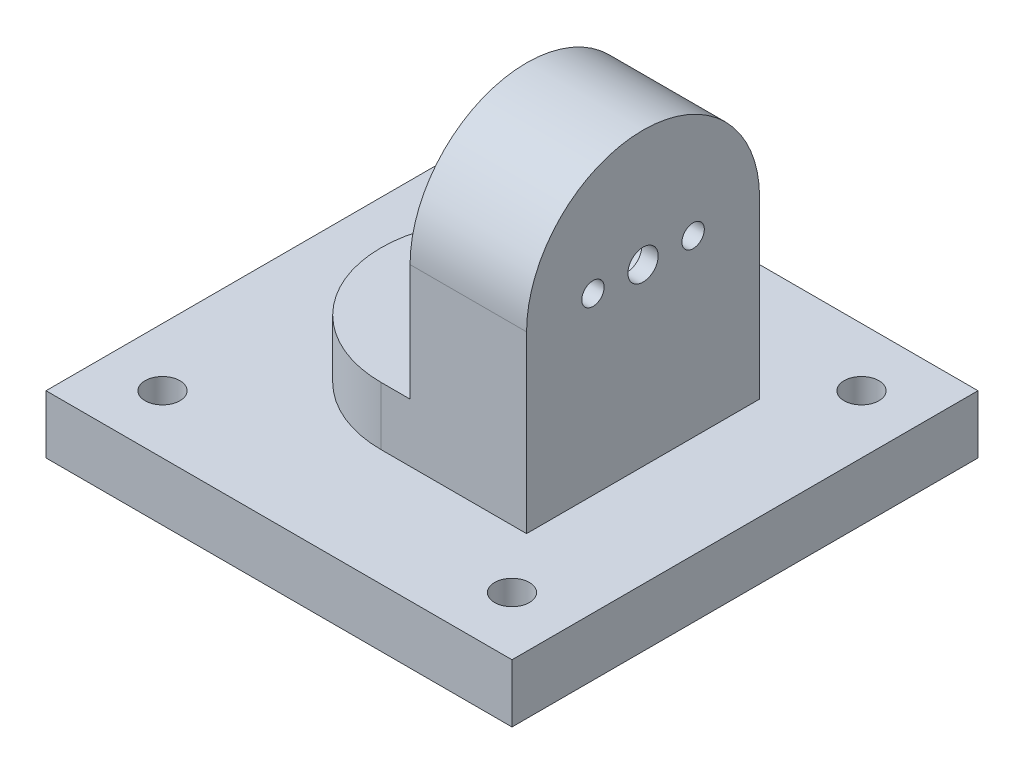
ISO-10303-21;
HEADER;
FILE_DESCRIPTION(('STEP AP214'),'2;1');
FILE_NAME('part.step','',(''),(''),'','','');
FILE_SCHEMA(('AUTOMOTIVE_DESIGN { 1 0 10303 214 1 1 1 1 }'));
ENDSEC;
DATA;
#1=APPLICATION_CONTEXT('core data for automotive mechanical design processes');
#2=APPLICATION_PROTOCOL_DEFINITION('international standard','automotive_design',2000,#1);
#3=PRODUCT_CONTEXT('',#1,'mechanical');
#4=PRODUCT('Part','Part','',(#3));
#5=PRODUCT_RELATED_PRODUCT_CATEGORY('part','',(#4));
#6=PRODUCT_DEFINITION_FORMATION('','',#4);
#7=PRODUCT_DEFINITION_CONTEXT('part definition',#1,'design');
#8=PRODUCT_DEFINITION('design','',#6,#7);
#9=PRODUCT_DEFINITION_SHAPE('','',#8);
#10=(LENGTH_UNIT() NAMED_UNIT(*) SI_UNIT(.MILLI.,.METRE.));
#11=(NAMED_UNIT(*) PLANE_ANGLE_UNIT() SI_UNIT($,.RADIAN.));
#12=(NAMED_UNIT(*) SI_UNIT($,.STERADIAN.) SOLID_ANGLE_UNIT());
#13=UNCERTAINTY_MEASURE_WITH_UNIT(LENGTH_MEASURE(1.E-05),#10,'distance_accuracy_value','');
#14=(GEOMETRIC_REPRESENTATION_CONTEXT(3) GLOBAL_UNCERTAINTY_ASSIGNED_CONTEXT((#13)) GLOBAL_UNIT_ASSIGNED_CONTEXT((#10,
#11,#12)) REPRESENTATION_CONTEXT('',''));
#15=CARTESIAN_POINT('',(0.,0.,0.));
#16=DIRECTION('',(0.,0.,1.));
#17=DIRECTION('',(1.,0.,0.));
#18=AXIS2_PLACEMENT_3D('',#15,#16,#17);
#19=CARTESIAN_POINT('',(39.2236659147798,19.05,0.));
#20=DIRECTION('',(-1.,0.,0.));
#21=DIRECTION('',(0.,0.,1.));
#22=AXIS2_PLACEMENT_3D('',#19,#20,#21);
#23=CYLINDRICAL_SURFACE('',#22,8.255);
#24=CARTESIAN_POINT('',(11.5377722,19.05,0.));
#25=DIRECTION('',(-1.,0.,0.));
#26=DIRECTION('',(0.,0.,1.));
#27=AXIS2_PLACEMENT_3D('',#24,#25,#26);
#28=CIRCLE('',#27,8.255);
#29=CARTESIAN_POINT('',(11.5377722,19.05,8.255));
#30=VERTEX_POINT('',#29);
#31=EDGE_CURVE('E167',#30,#30,#28,.F.);
#32=ORIENTED_EDGE('',*,*,#31,.T.);
#33=EDGE_LOOP('',(#32));
#34=FACE_BOUND('',#33,.T.);
#35=CARTESIAN_POINT('',(8.3627722,19.05,0.));
#36=DIRECTION('',(-1.,0.,0.));
#37=DIRECTION('',(0.,0.,1.));
#38=AXIS2_PLACEMENT_3D('',#35,#36,#37);
#39=CIRCLE('',#38,8.255);
#40=CARTESIAN_POINT('',(8.3627722,19.05,8.255));
#41=VERTEX_POINT('',#40);
#42=EDGE_CURVE('E43',#41,#41,#39,.F.);
#43=ORIENTED_EDGE('',*,*,#42,.F.);
#44=EDGE_LOOP('',(#43));
#45=FACE_BOUND('',#44,.T.);
#46=ADVANCED_FACE('F39',(#34,#45),#23,.F.);
#47=CARTESIAN_POINT('',(26.651307345283,19.05,0.));
#48=DIRECTION('',(-1.,0.,0.));
#49=DIRECTION('',(0.,0.,1.));
#50=AXIS2_PLACEMENT_3D('',#47,#48,#49);
#51=CYLINDRICAL_SURFACE('',#50,3.81);
#52=CARTESIAN_POINT('',(14.0777722,19.05,0.));
#53=DIRECTION('',(-1.,0.,0.));
#54=DIRECTION('',(0.,0.,1.));
#55=AXIS2_PLACEMENT_3D('',#52,#53,#54);
#56=CIRCLE('',#55,3.81);
#57=CARTESIAN_POINT('',(14.0777722,19.05,3.81));
#58=VERTEX_POINT('',#57);
#59=EDGE_CURVE('E171',#58,#58,#56,.F.);
#60=CARTESIAN_POINT('',(11.5377722,19.05,0.));
#61=DIRECTION('',(-1.,0.,0.));
#62=DIRECTION('',(0.,0.,1.));
#63=AXIS2_PLACEMENT_3D('',#60,#61,#62);
#64=CIRCLE('',#63,3.81);
#65=CARTESIAN_POINT('',(11.5377722,19.05,3.81));
#66=VERTEX_POINT('',#65);
#67=EDGE_CURVE('E170',#66,#66,#64,.F.);
#68=CARTESIAN_POINT('',(14.0777722,19.05,3.81));
#69=CARTESIAN_POINT('',(14.0513138666667,19.05,3.81));
#70=CARTESIAN_POINT('',(14.0248555333333,19.05,3.81));
#71=CARTESIAN_POINT('',(13.9719388666667,19.05,3.81));
#72=CARTESIAN_POINT('',(13.9454805333333,19.05,3.81));
#73=CARTESIAN_POINT('',(13.8925638666667,19.05,3.81));
#74=CARTESIAN_POINT('',(13.8661055333333,19.05,3.81));
#75=CARTESIAN_POINT('',(13.8131888666667,19.05,3.81));
#76=CARTESIAN_POINT('',(13.7867305333333,19.05,3.81));
#77=CARTESIAN_POINT('',(13.7338138666667,19.05,3.81));
#78=CARTESIAN_POINT('',(13.7073555333333,19.05,3.81));
#79=CARTESIAN_POINT('',(13.6544388666667,19.05,3.81));
#80=CARTESIAN_POINT('',(13.6279805333333,19.05,3.81));
#81=CARTESIAN_POINT('',(13.5750638666667,19.05,3.81));
#82=CARTESIAN_POINT('',(13.5486055333333,19.05,3.81));
#83=CARTESIAN_POINT('',(13.4956888666667,19.05,3.81));
#84=CARTESIAN_POINT('',(13.4692305333333,19.05,3.81));
#85=CARTESIAN_POINT('',(13.4163138666667,19.05,3.81));
#86=CARTESIAN_POINT('',(13.3898555333333,19.05,3.81));
#87=CARTESIAN_POINT('',(13.3369388666667,19.05,3.81));
#88=CARTESIAN_POINT('',(13.3104805333333,19.05,3.81));
#89=CARTESIAN_POINT('',(13.2575638666667,19.05,3.81));
#90=CARTESIAN_POINT('',(13.2311055333333,19.05,3.81));
#91=CARTESIAN_POINT('',(13.1781888666667,19.05,3.81));
#92=CARTESIAN_POINT('',(13.1517305333333,19.05,3.81));
#93=CARTESIAN_POINT('',(13.0988138666667,19.05,3.81));
#94=CARTESIAN_POINT('',(13.0723555333333,19.05,3.81));
#95=CARTESIAN_POINT('',(13.0194388666667,19.05,3.81));
#96=CARTESIAN_POINT('',(12.9929805333333,19.05,3.81));
#97=CARTESIAN_POINT('',(12.9400638666667,19.05,3.81));
#98=CARTESIAN_POINT('',(12.9136055333333,19.05,3.81));
#99=CARTESIAN_POINT('',(12.8606888666667,19.05,3.81));
#100=CARTESIAN_POINT('',(12.8342305333333,19.05,3.81));
#101=CARTESIAN_POINT('',(12.7813138666667,19.05,3.81));
#102=CARTESIAN_POINT('',(12.7548555333333,19.05,3.81));
#103=CARTESIAN_POINT('',(12.7019388666667,19.05,3.81));
#104=CARTESIAN_POINT('',(12.6754805333333,19.05,3.81));
#105=CARTESIAN_POINT('',(12.6225638666667,19.05,3.81));
#106=CARTESIAN_POINT('',(12.5961055333333,19.05,3.81));
#107=CARTESIAN_POINT('',(12.5431888666667,19.05,3.81));
#108=CARTESIAN_POINT('',(12.5167305333333,19.05,3.81));
#109=CARTESIAN_POINT('',(12.4638138666667,19.05,3.81));
#110=CARTESIAN_POINT('',(12.4373555333333,19.05,3.81));
#111=CARTESIAN_POINT('',(12.3844388666667,19.05,3.81));
#112=CARTESIAN_POINT('',(12.3579805333333,19.05,3.81));
#113=CARTESIAN_POINT('',(12.3050638666667,19.05,3.81));
#114=CARTESIAN_POINT('',(12.2786055333333,19.05,3.81));
#115=CARTESIAN_POINT('',(12.2256888666667,19.05,3.81));
#116=CARTESIAN_POINT('',(12.1992305333333,19.05,3.81));
#117=CARTESIAN_POINT('',(12.1463138666667,19.05,3.81));
#118=CARTESIAN_POINT('',(12.1198555333333,19.05,3.81));
#119=CARTESIAN_POINT('',(12.0669388666667,19.05,3.81));
#120=CARTESIAN_POINT('',(12.0404805333333,19.05,3.81));
#121=CARTESIAN_POINT('',(11.9875638666667,19.05,3.81));
#122=CARTESIAN_POINT('',(11.9611055333333,19.05,3.81));
#123=CARTESIAN_POINT('',(11.9081888666667,19.05,3.81));
#124=CARTESIAN_POINT('',(11.8817305333333,19.05,3.81));
#125=CARTESIAN_POINT('',(11.8288138666667,19.05,3.81));
#126=CARTESIAN_POINT('',(11.8023555333333,19.05,3.81));
#127=CARTESIAN_POINT('',(11.7494388666667,19.05,3.81));
#128=CARTESIAN_POINT('',(11.7229805333333,19.05,3.81));
#129=CARTESIAN_POINT('',(11.6700638666667,19.05,3.81));
#130=CARTESIAN_POINT('',(11.6436055333333,19.05,3.81));
#131=CARTESIAN_POINT('',(11.5906888666667,19.05,3.81));
#132=CARTESIAN_POINT('',(11.5642305333333,19.05,3.81));
#133=CARTESIAN_POINT('',(11.5377722,19.05,3.81));
#134=B_SPLINE_CURVE_WITH_KNOTS('',3,(#68,#69,#70,#71,#72,#73,#74,#75,#76,#77,#78,#79,#80,#81,
#82,#83,#84,#85,#86,#87,#88,#89,#90,#91,#92,#93,#94,#95,#96,#97,#98,#99,#100,#101,#102,#103,
#104,#105,#106,#107,#108,#109,#110,#111,#112,#113,#114,#115,#116,#117,#118,#119,#120,#121,#122,
#123,#124,#125,#126,#127,#128,#129,#130,#131,#132,#133),.UNSPECIFIED.,.F.,.F.,(4,2,2,2,2,2,2,2,
2,2,2,2,2,2,2,2,2,2,2,2,2,2,2,2,2,2,2,2,2,2,2,2,4),(0.,0.0793749999999996,0.158749999999999,
0.238125,0.3175,0.396875,0.476249999999999,0.555624999999999,0.635,0.714375,0.793749999999999,
0.873124999999999,0.952499999999998,1.031875,1.11125,1.190625,1.27,1.349375,1.42875,1.508125,
1.5875,1.666875,1.74625,1.825625,1.905,1.984375,2.06375,2.143125,2.2225,2.301875,2.38125,
2.460625,2.54),.UNSPECIFIED.);
#135=EDGE_CURVE('BSEAM208',#58,#66,#134,.T.);
#136=ORIENTED_EDGE('',*,*,#59,.T.);
#137=ORIENTED_EDGE('',*,*,#67,.F.);
#138=ORIENTED_EDGE('',*,*,#135,.T.);
#139=ORIENTED_EDGE('',*,*,#135,.F.);
#140=EDGE_LOOP('',(#136,#138,#137,#139));
#141=FACE_BOUND('',#140,.T.);
#142=ADVANCED_FACE('F208',(#141),#51,.F.);
#143=CARTESIAN_POINT('',(20.544733182956,19.05,0.));
#144=DIRECTION('',(-1.,0.,0.));
#145=DIRECTION('',(0.,0.,1.));
#146=AXIS2_PLACEMENT_3D('',#143,#144,#145);
#147=CYLINDRICAL_SURFACE('',#146,1.651);
#148=CARTESIAN_POINT('',(15.875,19.05,0.));
#149=DIRECTION('',(-1.,0.,0.));
#150=DIRECTION('',(0.,0.,1.));
#151=AXIS2_PLACEMENT_3D('',#148,#149,#150);
#152=CIRCLE('',#151,1.651);
#153=CARTESIAN_POINT('',(15.875,19.05,1.651));
#154=VERTEX_POINT('',#153);
#155=EDGE_CURVE('E175',#154,#154,#152,.F.);
#156=ORIENTED_EDGE('',*,*,#155,.T.);
#157=EDGE_LOOP('',(#156));
#158=FACE_BOUND('',#157,.T.);
#159=CARTESIAN_POINT('',(14.0777722,19.05,0.));
#160=DIRECTION('',(-1.,0.,0.));
#161=DIRECTION('',(0.,0.,1.));
#162=AXIS2_PLACEMENT_3D('',#159,#160,#161);
#163=CIRCLE('',#162,1.651);
#164=CARTESIAN_POINT('',(14.0777722,19.05,1.651));
#165=VERTEX_POINT('',#164);
#166=EDGE_CURVE('E174',#165,#165,#163,.F.);
#167=ORIENTED_EDGE('',*,*,#166,.F.);
#168=EDGE_LOOP('',(#167));
#169=FACE_BOUND('',#168,.T.);
#170=ADVANCED_FACE('F210',(#158,#169),#147,.F.);
#171=CARTESIAN_POINT('',(0.,6.35,0.));
#172=DIRECTION('',(0.,-1.,0.));
#173=DIRECTION('',(0.,0.,-1.));
#174=AXIS2_PLACEMENT_3D('',#171,#172,#173);
#175=CYLINDRICAL_SURFACE('',#174,12.7);
#176=CARTESIAN_POINT('',(0.,6.35,0.));
#177=DIRECTION('',(0.,1.,0.));
#178=DIRECTION('',(0.,0.,1.));
#179=AXIS2_PLACEMENT_3D('',#176,#177,#178);
#180=CIRCLE('',#179,12.7);
#181=CARTESIAN_POINT('',(0.,6.35,-12.7));
#182=VERTEX_POINT('',#181);
#183=CARTESIAN_POINT('',(0.,6.35,12.7));
#184=VERTEX_POINT('',#183);
#185=EDGE_CURVE('E12',#182,#184,#180,.T.);
#186=ORIENTED_EDGE('',*,*,#185,.F.);
#187=DIRECTION('',(0.,1.,0.));
#188=VECTOR('',#187,1.);
#189=CARTESIAN_POINT('',(0.,-29.9528900942797,-12.7));
#190=LINE('',#189,#188);
#191=CARTESIAN_POINT('',(0.,0.,-12.7));
#192=VERTEX_POINT('',#191);
#193=EDGE_CURVE('E490',#192,#182,#190,.T.);
#194=ORIENTED_EDGE('',*,*,#193,.F.);
#195=CARTESIAN_POINT('',(0.,0.,0.));
#196=DIRECTION('',(0.,1.,0.));
#197=DIRECTION('',(0.,0.,1.));
#198=AXIS2_PLACEMENT_3D('',#195,#196,#197);
#199=CIRCLE('',#198,12.7);
#200=CARTESIAN_POINT('',(0.,0.,12.7));
#201=VERTEX_POINT('',#200);
#202=EDGE_CURVE('E48',#192,#201,#199,.T.);
#203=ORIENTED_EDGE('',*,*,#202,.T.);
#204=DIRECTION('',(0.,1.,0.));
#205=VECTOR('',#204,1.);
#206=CARTESIAN_POINT('',(0.,-29.9528900942797,12.7));
#207=LINE('',#206,#205);
#208=EDGE_CURVE('E494',#201,#184,#207,.T.);
#209=ORIENTED_EDGE('',*,*,#208,.T.);
#210=EDGE_LOOP('',(#186,#194,#203,#209));
#211=FACE_BOUND('',#210,.T.);
#212=ADVANCED_FACE('F41',(#211),#175,.T.);
#213=CARTESIAN_POINT('',(0.,6.35,0.));
#214=DIRECTION('',(0.,1.,0.));
#215=DIRECTION('',(0.,0.,1.));
#216=AXIS2_PLACEMENT_3D('',#213,#214,#215);
#217=PLANE('',#216);
#218=DIRECTION('',(0.,0.,1.));
#219=VECTOR('',#218,1.);
#220=CARTESIAN_POINT('',(3.175,6.35,0.));
#221=LINE('',#220,#219);
#222=CARTESIAN_POINT('',(3.175,6.35,-12.7));
#223=VERTEX_POINT('',#222);
#224=CARTESIAN_POINT('',(3.175,6.35,12.7));
#225=VERTEX_POINT('',#224);
#226=EDGE_CURVE('E56',#223,#225,#221,.T.);
#227=ORIENTED_EDGE('',*,*,#226,.F.);
#228=DIRECTION('',(1.,0.,0.));
#229=VECTOR('',#228,1.);
#230=CARTESIAN_POINT('',(0.,6.35,-12.7));
#231=LINE('',#230,#229);
#232=EDGE_CURVE('E190',#182,#223,#231,.T.);
#233=ORIENTED_EDGE('',*,*,#232,.F.);
#234=ORIENTED_EDGE('',*,*,#185,.T.);
#235=DIRECTION('',(-1.,0.,0.));
#236=VECTOR('',#235,1.);
#237=CARTESIAN_POINT('',(0.,6.35,12.7));
#238=LINE('',#237,#236);
#239=EDGE_CURVE('E499',#225,#184,#238,.T.);
#240=ORIENTED_EDGE('',*,*,#239,.F.);
#241=EDGE_LOOP('',(#227,#233,#234,#240));
#242=FACE_BOUND('',#241,.T.);
#243=ADVANCED_FACE('F240',(#242),#217,.T.);
#244=CARTESIAN_POINT('',(15.875,-29.9528900942797,0.));
#245=DIRECTION('',(-1.,0.,0.));
#246=DIRECTION('',(0.,0.,1.));
#247=AXIS2_PLACEMENT_3D('',#244,#245,#246);
#248=PLANE('',#247);
#249=CARTESIAN_POINT('',(15.875,19.05,-5.4599967));
#250=DIRECTION('',(-1.,0.,0.));
#251=DIRECTION('',(0.,0.,1.));
#252=AXIS2_PLACEMENT_3D('',#249,#250,#251);
#253=CIRCLE('',#252,1.2192);
#254=CARTESIAN_POINT('',(15.875,19.05,-4.2407967));
#255=VERTEX_POINT('',#254);
#256=EDGE_CURVE('E147',#255,#255,#253,.F.);
#257=ORIENTED_EDGE('',*,*,#256,.F.);
#258=EDGE_LOOP('',(#257));
#259=FACE_BOUND('',#258,.T.);
#260=CARTESIAN_POINT('',(15.875,19.05,5.4599967));
#261=DIRECTION('',(-1.,0.,0.));
#262=DIRECTION('',(0.,0.,1.));
#263=AXIS2_PLACEMENT_3D('',#260,#261,#262);
#264=CIRCLE('',#263,1.2192);
#265=CARTESIAN_POINT('',(15.875,19.05,6.6791967));
#266=VERTEX_POINT('',#265);
#267=EDGE_CURVE('E158',#266,#266,#264,.F.);
#268=ORIENTED_EDGE('',*,*,#267,.F.);
#269=EDGE_LOOP('',(#268));
#270=FACE_BOUND('',#269,.T.);
#271=ORIENTED_EDGE('',*,*,#155,.F.);
#272=EDGE_LOOP('',(#271));
#273=FACE_BOUND('',#272,.T.);
#274=DIRECTION('',(0.,1.,0.));
#275=VECTOR('',#274,1.);
#276=CARTESIAN_POINT('',(15.875,-29.9528900942797,12.7));
#277=LINE('',#276,#275);
#278=CARTESIAN_POINT('',(15.875,0.,12.7));
#279=VERTEX_POINT('',#278);
#280=CARTESIAN_POINT('',(15.875,19.05,12.7));
#281=VERTEX_POINT('',#280);
#282=EDGE_CURVE('E491',#279,#281,#277,.T.);
#283=ORIENTED_EDGE('',*,*,#282,.F.);
#284=DIRECTION('',(0.,0.,-1.));
#285=VECTOR('',#284,1.);
#286=CARTESIAN_POINT('',(15.875,0.,0.));
#287=LINE('',#286,#285);
#288=CARTESIAN_POINT('',(15.875,0.,-12.7));
#289=VERTEX_POINT('',#288);
#290=EDGE_CURVE('E479',#279,#289,#287,.T.);
#291=ORIENTED_EDGE('',*,*,#290,.T.);
#292=DIRECTION('',(0.,1.,0.));
#293=VECTOR('',#292,1.);
#294=CARTESIAN_POINT('',(15.875,-29.9528900942797,-12.7));
#295=LINE('',#294,#293);
#296=CARTESIAN_POINT('',(15.875,19.05,-12.7));
#297=VERTEX_POINT('',#296);
#298=EDGE_CURVE('E485',#289,#297,#295,.T.);
#299=ORIENTED_EDGE('',*,*,#298,.T.);
#300=CARTESIAN_POINT('',(15.875,19.05,0.));
#301=DIRECTION('',(1.,0.,0.));
#302=DIRECTION('',(0.,0.,-1.));
#303=AXIS2_PLACEMENT_3D('',#300,#301,#302);
#304=CIRCLE('',#303,12.7);
#305=EDGE_CURVE('E178',#297,#281,#304,.T.);
#306=ORIENTED_EDGE('',*,*,#305,.T.);
#307=EDGE_LOOP('',(#283,#291,#299,#306));
#308=FACE_BOUND('',#307,.T.);
#309=ADVANCED_FACE('F236',(#259,#270,#273,#308),#248,.F.);
#310=CARTESIAN_POINT('',(0.,-29.9528900942797,-12.7));
#311=DIRECTION('',(0.,0.,1.));
#312=DIRECTION('',(1.,0.,0.));
#313=AXIS2_PLACEMENT_3D('',#310,#311,#312);
#314=PLANE('',#313);
#315=ORIENTED_EDGE('',*,*,#298,.F.);
#316=DIRECTION('',(-1.,0.,0.));
#317=VECTOR('',#316,1.);
#318=CARTESIAN_POINT('',(0.,0.,-12.7));
#319=LINE('',#318,#317);
#320=EDGE_CURVE('E476',#289,#192,#319,.T.);
#321=ORIENTED_EDGE('',*,*,#320,.T.);
#322=ORIENTED_EDGE('',*,*,#193,.T.);
#323=ORIENTED_EDGE('',*,*,#232,.T.);
#324=DIRECTION('',(0.,1.,0.));
#325=VECTOR('',#324,1.);
#326=CARTESIAN_POINT('',(3.175,0.,-12.7));
#327=LINE('',#326,#325);
#328=CARTESIAN_POINT('',(3.175,19.05,-12.7));
#329=VERTEX_POINT('',#328);
#330=EDGE_CURVE('E189',#223,#329,#327,.T.);
#331=ORIENTED_EDGE('',*,*,#330,.T.);
#332=DIRECTION('',(1.,0.,0.));
#333=VECTOR('',#332,1.);
#334=CARTESIAN_POINT('',(3.175,19.05,-12.7));
#335=LINE('',#334,#333);
#336=EDGE_CURVE('E486',#329,#297,#335,.T.);
#337=ORIENTED_EDGE('',*,*,#336,.T.);
#338=EDGE_LOOP('',(#315,#321,#322,#323,#331,#337));
#339=FACE_BOUND('',#338,.T.);
#340=ADVANCED_FACE('F233',(#339),#314,.F.);
#341=CARTESIAN_POINT('',(0.,-29.9528900942797,12.7));
#342=DIRECTION('',(0.,0.,-1.));
#343=DIRECTION('',(-1.,0.,0.));
#344=AXIS2_PLACEMENT_3D('',#341,#342,#343);
#345=PLANE('',#344);
#346=ORIENTED_EDGE('',*,*,#208,.F.);
#347=DIRECTION('',(1.,0.,0.));
#348=VECTOR('',#347,1.);
#349=CARTESIAN_POINT('',(0.,0.,12.7));
#350=LINE('',#349,#348);
#351=EDGE_CURVE('E482',#201,#279,#350,.T.);
#352=ORIENTED_EDGE('',*,*,#351,.T.);
#353=ORIENTED_EDGE('',*,*,#282,.T.);
#354=DIRECTION('',(1.,0.,0.));
#355=VECTOR('',#354,1.);
#356=CARTESIAN_POINT('',(3.175,19.05,12.7));
#357=LINE('',#356,#355);
#358=CARTESIAN_POINT('',(3.175,19.05,12.7));
#359=VERTEX_POINT('',#358);
#360=EDGE_CURVE('E199',#359,#281,#357,.T.);
#361=ORIENTED_EDGE('',*,*,#360,.F.);
#362=DIRECTION('',(0.,-1.,0.));
#363=VECTOR('',#362,1.);
#364=CARTESIAN_POINT('',(3.175,0.,12.7));
#365=LINE('',#364,#363);
#366=EDGE_CURVE('E182',#359,#225,#365,.T.);
#367=ORIENTED_EDGE('',*,*,#366,.T.);
#368=ORIENTED_EDGE('',*,*,#239,.T.);
#369=EDGE_LOOP('',(#346,#352,#353,#361,#367,#368));
#370=FACE_BOUND('',#369,.T.);
#371=ADVANCED_FACE('F231',(#370),#345,.F.);
#372=CARTESIAN_POINT('',(3.175,19.05,0.));
#373=DIRECTION('',(1.,0.,0.));
#374=DIRECTION('',(0.,0.,-1.));
#375=AXIS2_PLACEMENT_3D('',#372,#373,#374);
#376=CYLINDRICAL_SURFACE('',#375,12.7);
#377=ORIENTED_EDGE('',*,*,#305,.F.);
#378=ORIENTED_EDGE('',*,*,#336,.F.);
#379=CARTESIAN_POINT('',(3.175,19.05,0.));
#380=DIRECTION('',(1.,0.,0.));
#381=DIRECTION('',(0.,0.,-1.));
#382=AXIS2_PLACEMENT_3D('',#379,#380,#381);
#383=CIRCLE('',#382,12.7);
#384=EDGE_CURVE('E179',#329,#359,#383,.T.);
#385=ORIENTED_EDGE('',*,*,#384,.T.);
#386=ORIENTED_EDGE('',*,*,#360,.T.);
#387=EDGE_LOOP('',(#377,#378,#385,#386));
#388=FACE_BOUND('',#387,.T.);
#389=ADVANCED_FACE('F227',(#388),#376,.T.);
#390=CARTESIAN_POINT('',(3.175,0.,0.));
#391=DIRECTION('',(1.,0.,0.));
#392=DIRECTION('',(0.,0.,-1.));
#393=AXIS2_PLACEMENT_3D('',#390,#391,#392);
#394=PLANE('',#393);
#395=CARTESIAN_POINT('',(3.175,19.05,0.));
#396=DIRECTION('',(-1.,0.,0.));
#397=DIRECTION('',(0.,0.,1.));
#398=AXIS2_PLACEMENT_3D('',#395,#396,#397);
#399=CIRCLE('',#398,9.525);
#400=CARTESIAN_POINT('',(3.175,19.05,9.525));
#401=VERTEX_POINT('',#400);
#402=EDGE_CURVE('E161',#401,#401,#399,.T.);
#403=ORIENTED_EDGE('',*,*,#402,.F.);
#404=EDGE_LOOP('',(#403));
#405=FACE_BOUND('',#404,.T.);
#406=ORIENTED_EDGE('',*,*,#384,.F.);
#407=ORIENTED_EDGE('',*,*,#330,.F.);
#408=ORIENTED_EDGE('',*,*,#226,.T.);
#409=ORIENTED_EDGE('',*,*,#366,.F.);
#410=EDGE_LOOP('',(#406,#407,#408,#409));
#411=FACE_BOUND('',#410,.T.);
#412=ADVANCED_FACE('F224',(#405,#411),#394,.F.);
#413=CARTESIAN_POINT('',(14.0777722,-29.9528900942797,0.));
#414=DIRECTION('',(-1.,0.,0.));
#415=DIRECTION('',(0.,0.,1.));
#416=AXIS2_PLACEMENT_3D('',#413,#414,#415);
#417=PLANE('',#416);
#418=ORIENTED_EDGE('',*,*,#59,.F.);
#419=EDGE_LOOP('',(#418));
#420=FACE_BOUND('',#419,.T.);
#421=ORIENTED_EDGE('',*,*,#166,.T.);
#422=EDGE_LOOP('',(#421));
#423=FACE_BOUND('',#422,.T.);
#424=ADVANCED_FACE('F222',(#420,#423),#417,.T.);
#425=CARTESIAN_POINT('',(11.5377722,-29.9528900942797,0.));
#426=DIRECTION('',(-1.,0.,0.));
#427=DIRECTION('',(0.,0.,1.));
#428=AXIS2_PLACEMENT_3D('',#425,#426,#427);
#429=PLANE('',#428);
#430=CARTESIAN_POINT('',(11.5377722,19.05,-5.4599967));
#431=DIRECTION('',(-1.,0.,0.));
#432=DIRECTION('',(0.,0.,1.));
#433=AXIS2_PLACEMENT_3D('',#430,#431,#432);
#434=CIRCLE('',#433,1.2192);
#435=CARTESIAN_POINT('',(11.5377722,19.05,-4.2407967));
#436=VERTEX_POINT('',#435);
#437=EDGE_CURVE('E144',#436,#436,#434,.T.);
#438=ORIENTED_EDGE('',*,*,#437,.F.);
#439=EDGE_LOOP('',(#438));
#440=FACE_BOUND('',#439,.T.);
#441=CARTESIAN_POINT('',(11.5377722,19.05,5.4599967));
#442=DIRECTION('',(-1.,0.,0.));
#443=DIRECTION('',(0.,0.,1.));
#444=AXIS2_PLACEMENT_3D('',#441,#442,#443);
#445=CIRCLE('',#444,1.2192);
#446=CARTESIAN_POINT('',(11.5377722,19.05,6.6791967));
#447=VERTEX_POINT('',#446);
#448=EDGE_CURVE('E155',#447,#447,#445,.T.);
#449=ORIENTED_EDGE('',*,*,#448,.F.);
#450=EDGE_LOOP('',(#449));
#451=FACE_BOUND('',#450,.T.);
#452=ORIENTED_EDGE('',*,*,#31,.F.);
#453=EDGE_LOOP('',(#452));
#454=FACE_BOUND('',#453,.T.);
#455=ORIENTED_EDGE('',*,*,#67,.T.);
#456=EDGE_LOOP('',(#455));
#457=FACE_BOUND('',#456,.T.);
#458=ADVANCED_FACE('F206',(#440,#451,#454,#457),#429,.T.);
#459=CARTESIAN_POINT('',(8.3627722,-29.9528900942797,0.));
#460=DIRECTION('',(-1.,0.,0.));
#461=DIRECTION('',(0.,0.,1.));
#462=AXIS2_PLACEMENT_3D('',#459,#460,#461);
#463=PLANE('',#462);
#464=CARTESIAN_POINT('',(8.36277220000001,19.05,0.));
#465=DIRECTION('',(-1.,0.,0.));
#466=DIRECTION('',(0.,0.,1.));
#467=AXIS2_PLACEMENT_3D('',#464,#465,#466);
#468=CIRCLE('',#467,9.525);
#469=CARTESIAN_POINT('',(8.36277220000001,19.05,9.525));
#470=VERTEX_POINT('',#469);
#471=EDGE_CURVE('E164',#470,#470,#468,.F.);
#472=ORIENTED_EDGE('',*,*,#471,.F.);
#473=EDGE_LOOP('',(#472));
#474=FACE_BOUND('',#473,.T.);
#475=ORIENTED_EDGE('',*,*,#42,.T.);
#476=EDGE_LOOP('',(#475));
#477=FACE_BOUND('',#476,.T.);
#478=ADVANCED_FACE('F292',(#474,#477),#463,.T.);
#479=CARTESIAN_POINT('',(42.8157683632075,19.05,0.));
#480=DIRECTION('',(-1.,0.,0.));
#481=DIRECTION('',(0.,0.,1.));
#482=AXIS2_PLACEMENT_3D('',#479,#480,#481);
#483=CYLINDRICAL_SURFACE('',#482,9.525);
#484=CARTESIAN_POINT('',(8.36277220000001,19.05,9.525));
#485=CARTESIAN_POINT('',(8.30873290625001,19.05,9.525));
#486=CARTESIAN_POINT('',(8.25469361250001,19.05,9.525));
#487=CARTESIAN_POINT('',(8.14661502500001,19.05,9.525));
#488=CARTESIAN_POINT('',(8.09257573125002,19.05,9.525));
#489=CARTESIAN_POINT('',(7.98449714375001,19.05,9.525));
#490=CARTESIAN_POINT('',(7.93045785000001,19.05,9.525));
#491=CARTESIAN_POINT('',(7.82237926250001,19.05,9.525));
#492=CARTESIAN_POINT('',(7.76833996875001,19.05,9.525));
#493=CARTESIAN_POINT('',(7.66026138125001,19.05,9.525));
#494=CARTESIAN_POINT('',(7.60622208750001,19.05,9.525));
#495=CARTESIAN_POINT('',(7.49814350000002,19.05,9.525));
#496=CARTESIAN_POINT('',(7.44410420625001,19.05,9.525));
#497=CARTESIAN_POINT('',(7.33602561875002,19.05,9.525));
#498=CARTESIAN_POINT('',(7.28198632500001,19.05,9.525));
#499=CARTESIAN_POINT('',(7.17390773750002,19.05,9.525));
#500=CARTESIAN_POINT('',(7.11986844375001,19.05,9.525));
#501=CARTESIAN_POINT('',(7.01178985625001,19.05,9.525));
#502=CARTESIAN_POINT('',(6.95775056250001,19.05,9.525));
#503=CARTESIAN_POINT('',(6.84967197500001,19.05,9.525));
#504=CARTESIAN_POINT('',(6.79563268125001,19.05,9.525));
#505=CARTESIAN_POINT('',(6.68755409375001,19.05,9.525));
#506=CARTESIAN_POINT('',(6.63351480000001,19.05,9.525));
#507=CARTESIAN_POINT('',(6.52543621250001,19.05,9.525));
#508=CARTESIAN_POINT('',(6.47139691875001,19.05,9.525));
#509=CARTESIAN_POINT('',(6.36331833125001,19.05,9.525));
#510=CARTESIAN_POINT('',(6.30927903750001,19.05,9.525));
#511=CARTESIAN_POINT('',(6.20120045000001,19.05,9.525));
#512=CARTESIAN_POINT('',(6.14716115625001,19.05,9.525));
#513=CARTESIAN_POINT('',(6.03908256875001,19.05,9.525));
#514=CARTESIAN_POINT('',(5.98504327500001,19.05,9.525));
#515=CARTESIAN_POINT('',(5.87696468750001,19.05,9.525));
#516=CARTESIAN_POINT('',(5.82292539375001,19.05,9.525));
#517=CARTESIAN_POINT('',(5.71484680625001,19.05,9.525));
#518=CARTESIAN_POINT('',(5.66080751250001,19.05,9.525));
#519=CARTESIAN_POINT('',(5.55272892500001,19.05,9.525));
#520=CARTESIAN_POINT('',(5.49868963125001,19.05,9.525));
#521=CARTESIAN_POINT('',(5.39061104375001,19.05,9.525));
#522=CARTESIAN_POINT('',(5.33657175000001,19.05,9.525));
#523=CARTESIAN_POINT('',(5.22849316250001,19.05,9.525));
#524=CARTESIAN_POINT('',(5.17445386875001,19.05,9.525));
#525=CARTESIAN_POINT('',(5.06637528125001,19.05,9.525));
#526=CARTESIAN_POINT('',(5.01233598750001,19.05,9.525));
#527=CARTESIAN_POINT('',(4.90425740000001,19.05,9.525));
#528=CARTESIAN_POINT('',(4.85021810625001,19.05,9.525));
#529=CARTESIAN_POINT('',(4.74213951875001,19.05,9.525));
#530=CARTESIAN_POINT('',(4.68810022500001,19.05,9.525));
#531=CARTESIAN_POINT('',(4.58002163750001,19.05,9.525));
#532=CARTESIAN_POINT('',(4.52598234375001,19.05,9.525));
#533=CARTESIAN_POINT('',(4.41790375625001,19.05,9.525));
#534=CARTESIAN_POINT('',(4.36386446250001,19.05,9.525));
#535=CARTESIAN_POINT('',(4.25578587500001,19.05,9.525));
#536=CARTESIAN_POINT('',(4.20174658125001,19.05,9.525));
#537=CARTESIAN_POINT('',(4.09366799375,19.05,9.525));
#538=CARTESIAN_POINT('',(4.0396287,19.05,9.525));
#539=CARTESIAN_POINT('',(3.9315501125,19.05,9.525));
#540=CARTESIAN_POINT('',(3.87751081875,19.05,9.525));
#541=CARTESIAN_POINT('',(3.76943223125,19.05,9.525));
#542=CARTESIAN_POINT('',(3.7153929375,19.05,9.525));
#543=CARTESIAN_POINT('',(3.60731435,19.05,9.525));
#544=CARTESIAN_POINT('',(3.55327505625,19.05,9.525));
#545=CARTESIAN_POINT('',(3.44519646875,19.05,9.525));
#546=CARTESIAN_POINT('',(3.391157175,19.05,9.525));
#547=CARTESIAN_POINT('',(3.2830785875,19.05,9.525));
#548=CARTESIAN_POINT('',(3.22903929375,19.05,9.525));
#549=CARTESIAN_POINT('',(3.175,19.05,9.525));
#550=B_SPLINE_CURVE_WITH_KNOTS('',3,(#484,#485,#486,#487,#488,#489,#490,#491,#492,#493,#494,
#495,#496,#497,#498,#499,#500,#501,#502,#503,#504,#505,#506,#507,#508,#509,#510,#511,#512,#513,
#514,#515,#516,#517,#518,#519,#520,#521,#522,#523,#524,#525,#526,#527,#528,#529,#530,#531,#532,
#533,#534,#535,#536,#537,#538,#539,#540,#541,#542,#543,#544,#545,#546,#547,#548,#549),
.UNSPECIFIED.,.F.,.F.,(4,2,2,2,2,2,2,2,2,2,2,2,2,2,2,2,2,2,2,2,2,2,2,2,2,2,2,2,2,2,2,2,4),(0.,
0.16211788125,0.3242357625,0.48635364375,0.648471524999999,0.810589406249999,0.972707287499999,
1.13482516875,1.29694305,1.45906093125001,1.62117881250001,1.78329669375001,1.94541457500001,
2.10753245625001,2.26965033750001,2.43176821875001,2.59388610000001,2.75600398125,2.9181218625,
3.08023974375,3.242357625,3.40447550625,3.5665933875,3.72871126875,3.89082915000001,
4.05294703125,4.21506491250001,4.37718279375001,4.53930067500001,4.70141855625001,
4.86353643750001,5.02565431875001,5.18777220000001),.UNSPECIFIED.);
#551=EDGE_CURVE('BSEAM296',#470,#401,#550,.T.);
#552=ORIENTED_EDGE('',*,*,#471,.T.);
#553=ORIENTED_EDGE('',*,*,#402,.T.);
#554=ORIENTED_EDGE('',*,*,#551,.T.);
#555=ORIENTED_EDGE('',*,*,#551,.F.);
#556=EDGE_LOOP('',(#552,#554,#553,#555));
#557=FACE_BOUND('',#556,.T.);
#558=ADVANCED_FACE('F296',(#557),#483,.F.);
#559=CARTESIAN_POINT('',(19.3234183504906,19.05,5.4599967));
#560=DIRECTION('',(-1.,0.,0.));
#561=DIRECTION('',(0.,0.,1.));
#562=AXIS2_PLACEMENT_3D('',#559,#560,#561);
#563=CYLINDRICAL_SURFACE('',#562,1.2192);
#564=ORIENTED_EDGE('',*,*,#267,.T.);
#565=EDGE_LOOP('',(#564));
#566=FACE_BOUND('',#565,.T.);
#567=ORIENTED_EDGE('',*,*,#448,.T.);
#568=EDGE_LOOP('',(#567));
#569=FACE_BOUND('',#568,.T.);
#570=ADVANCED_FACE('F306',(#566,#569),#563,.F.);
#571=CARTESIAN_POINT('',(19.3234183504906,19.05,-5.4599967));
#572=DIRECTION('',(-1.,0.,0.));
#573=DIRECTION('',(0.,0.,1.));
#574=AXIS2_PLACEMENT_3D('',#571,#572,#573);
#575=CYLINDRICAL_SURFACE('',#574,1.2192);
#576=ORIENTED_EDGE('',*,*,#256,.T.);
#577=EDGE_LOOP('',(#576));
#578=FACE_BOUND('',#577,.T.);
#579=ORIENTED_EDGE('',*,*,#437,.T.);
#580=EDGE_LOOP('',(#579));
#581=FACE_BOUND('',#580,.T.);
#582=ADVANCED_FACE('F322',(#578,#581),#575,.F.);
#583=CARTESIAN_POINT('',(0.,0.,0.));
#584=DIRECTION('',(0.,1.,0.));
#585=DIRECTION('',(0.,0.,1.));
#586=AXIS2_PLACEMENT_3D('',#583,#584,#585);
#587=PLANE('',#586);
#588=CARTESIAN_POINT('',(20.6375,0.,-19.05));
#589=DIRECTION('',(0.,1.,0.));
#590=DIRECTION('',(0.,0.,1.));
#591=AXIS2_PLACEMENT_3D('',#588,#589,#590);
#592=CIRCLE('',#591,1.89864999999999);
#593=CARTESIAN_POINT('',(20.6375,0.,-17.15135));
#594=VERTEX_POINT('',#593);
#595=EDGE_CURVE('E435',#594,#594,#592,.T.);
#596=ORIENTED_EDGE('',*,*,#595,.F.);
#597=EDGE_LOOP('',(#596));
#598=FACE_BOUND('',#597,.T.);
#599=CARTESIAN_POINT('',(-17.4625,0.,-19.05));
#600=DIRECTION('',(0.,1.,0.));
#601=DIRECTION('',(0.,0.,1.));
#602=AXIS2_PLACEMENT_3D('',#599,#600,#601);
#603=CIRCLE('',#602,1.89864999999999);
#604=CARTESIAN_POINT('',(-17.4625,0.,-17.15135));
#605=VERTEX_POINT('',#604);
#606=EDGE_CURVE('E445',#605,#605,#603,.T.);
#607=ORIENTED_EDGE('',*,*,#606,.F.);
#608=EDGE_LOOP('',(#607));
#609=FACE_BOUND('',#608,.T.);
#610=CARTESIAN_POINT('',(-17.4625,0.,19.05));
#611=DIRECTION('',(0.,1.,0.));
#612=DIRECTION('',(0.,0.,1.));
#613=AXIS2_PLACEMENT_3D('',#610,#611,#612);
#614=CIRCLE('',#613,1.89864999999999);
#615=CARTESIAN_POINT('',(-17.4625,0.,20.94865));
#616=VERTEX_POINT('',#615);
#617=EDGE_CURVE('E451',#616,#616,#614,.T.);
#618=ORIENTED_EDGE('',*,*,#617,.F.);
#619=EDGE_LOOP('',(#618));
#620=FACE_BOUND('',#619,.T.);
#621=CARTESIAN_POINT('',(20.6375,0.,19.05));
#622=DIRECTION('',(0.,1.,0.));
#623=DIRECTION('',(0.,0.,1.));
#624=AXIS2_PLACEMENT_3D('',#621,#622,#623);
#625=CIRCLE('',#624,1.89864999999999);
#626=CARTESIAN_POINT('',(20.6375,0.,20.94865));
#627=VERTEX_POINT('',#626);
#628=EDGE_CURVE('E457',#627,#627,#625,.T.);
#629=ORIENTED_EDGE('',*,*,#628,.F.);
#630=EDGE_LOOP('',(#629));
#631=FACE_BOUND('',#630,.T.);
#632=DIRECTION('',(0.,0.,-1.));
#633=VECTOR('',#632,1.);
#634=CARTESIAN_POINT('',(-23.8125,0.,25.4));
#635=LINE('',#634,#633);
#636=CARTESIAN_POINT('',(-23.8125,0.,25.4));
#637=VERTEX_POINT('',#636);
#638=CARTESIAN_POINT('',(-23.8125,0.,-25.4));
#639=VERTEX_POINT('',#638);
#640=EDGE_CURVE('E143',#637,#639,#635,.T.);
#641=ORIENTED_EDGE('',*,*,#640,.F.);
#642=DIRECTION('',(-1.,0.,0.));
#643=VECTOR('',#642,1.);
#644=CARTESIAN_POINT('',(26.9875,0.,25.4));
#645=LINE('',#644,#643);
#646=CARTESIAN_POINT('',(26.9875,0.,25.4));
#647=VERTEX_POINT('',#646);
#648=EDGE_CURVE('E139',#647,#637,#645,.T.);
#649=ORIENTED_EDGE('',*,*,#648,.F.);
#650=DIRECTION('',(0.,0.,1.));
#651=VECTOR('',#650,1.);
#652=CARTESIAN_POINT('',(26.9875,0.,25.4));
#653=LINE('',#652,#651);
#654=CARTESIAN_POINT('',(26.9875,0.,-25.4));
#655=VERTEX_POINT('',#654);
#656=EDGE_CURVE('E466',#655,#647,#653,.T.);
#657=ORIENTED_EDGE('',*,*,#656,.F.);
#658=DIRECTION('',(1.,0.,0.));
#659=VECTOR('',#658,1.);
#660=CARTESIAN_POINT('',(26.9875,0.,-25.4));
#661=LINE('',#660,#659);
#662=EDGE_CURVE('E464',#639,#655,#661,.T.);
#663=ORIENTED_EDGE('',*,*,#662,.F.);
#664=EDGE_LOOP('',(#641,#649,#657,#663));
#665=FACE_BOUND('',#664,.T.);
#666=ORIENTED_EDGE('',*,*,#320,.F.);
#667=ORIENTED_EDGE('',*,*,#290,.F.);
#668=ORIENTED_EDGE('',*,*,#351,.F.);
#669=ORIENTED_EDGE('',*,*,#202,.F.);
#670=EDGE_LOOP('',(#666,#667,#668,#669));
#671=FACE_BOUND('',#670,.T.);
#672=ADVANCED_FACE('F331',(#598,#609,#620,#631,#665,#671),#587,.T.);
#673=CARTESIAN_POINT('',(-23.8125,-6.35,25.4));
#674=DIRECTION('',(1.,0.,0.));
#675=DIRECTION('',(0.,0.,-1.));
#676=AXIS2_PLACEMENT_3D('',#673,#674,#675);
#677=PLANE('',#676);
#678=ORIENTED_EDGE('',*,*,#640,.T.);
#679=DIRECTION('',(0.,1.,0.));
#680=VECTOR('',#679,1.);
#681=CARTESIAN_POINT('',(-23.8125,-6.35,-25.4));
#682=LINE('',#681,#680);
#683=CARTESIAN_POINT('',(-23.8125,-6.35,-25.4));
#684=VERTEX_POINT('',#683);
#685=EDGE_CURVE('E123',#684,#639,#682,.T.);
#686=ORIENTED_EDGE('',*,*,#685,.F.);
#687=DIRECTION('',(0.,0.,-1.));
#688=VECTOR('',#687,1.);
#689=CARTESIAN_POINT('',(-23.8125,-6.35,25.4));
#690=LINE('',#689,#688);
#691=CARTESIAN_POINT('',(-23.8125,-6.35,25.4));
#692=VERTEX_POINT('',#691);
#693=EDGE_CURVE('E130',#692,#684,#690,.T.);
#694=ORIENTED_EDGE('',*,*,#693,.F.);
#695=DIRECTION('',(0.,1.,0.));
#696=VECTOR('',#695,1.);
#697=CARTESIAN_POINT('',(-23.8125,-6.35,25.4));
#698=LINE('',#697,#696);
#699=EDGE_CURVE('E462',#692,#637,#698,.T.);
#700=ORIENTED_EDGE('',*,*,#699,.T.);
#701=EDGE_LOOP('',(#678,#686,#694,#700));
#702=FACE_BOUND('',#701,.T.);
#703=ADVANCED_FACE('F141',(#702),#677,.F.);
#704=CARTESIAN_POINT('',(26.9875,-6.35,-25.4));
#705=DIRECTION('',(0.,0.,1.));
#706=DIRECTION('',(1.,0.,0.));
#707=AXIS2_PLACEMENT_3D('',#704,#705,#706);
#708=PLANE('',#707);
#709=ORIENTED_EDGE('',*,*,#662,.T.);
#710=DIRECTION('',(0.,1.,0.));
#711=VECTOR('',#710,1.);
#712=CARTESIAN_POINT('',(26.9875,-6.35,-25.4));
#713=LINE('',#712,#711);
#714=CARTESIAN_POINT('',(26.9875,-6.35,-25.4));
#715=VERTEX_POINT('',#714);
#716=EDGE_CURVE('E126',#715,#655,#713,.T.);
#717=ORIENTED_EDGE('',*,*,#716,.F.);
#718=DIRECTION('',(1.,0.,0.));
#719=VECTOR('',#718,1.);
#720=CARTESIAN_POINT('',(26.9875,-6.35,-25.4));
#721=LINE('',#720,#719);
#722=EDGE_CURVE('E119',#684,#715,#721,.T.);
#723=ORIENTED_EDGE('',*,*,#722,.F.);
#724=ORIENTED_EDGE('',*,*,#685,.T.);
#725=EDGE_LOOP('',(#709,#717,#723,#724));
#726=FACE_BOUND('',#725,.T.);
#727=ADVANCED_FACE('F121',(#726),#708,.F.);
#728=CARTESIAN_POINT('',(26.9875,-6.35,25.4));
#729=DIRECTION('',(-1.,0.,0.));
#730=DIRECTION('',(0.,0.,1.));
#731=AXIS2_PLACEMENT_3D('',#728,#729,#730);
#732=PLANE('',#731);
#733=ORIENTED_EDGE('',*,*,#656,.T.);
#734=DIRECTION('',(0.,1.,0.));
#735=VECTOR('',#734,1.);
#736=CARTESIAN_POINT('',(26.9875,-6.35,25.4));
#737=LINE('',#736,#735);
#738=CARTESIAN_POINT('',(26.9875,-6.35,25.4));
#739=VERTEX_POINT('',#738);
#740=EDGE_CURVE('E149',#739,#647,#737,.T.);
#741=ORIENTED_EDGE('',*,*,#740,.F.);
#742=DIRECTION('',(0.,0.,1.));
#743=VECTOR('',#742,1.);
#744=CARTESIAN_POINT('',(26.9875,-6.35,25.4));
#745=LINE('',#744,#743);
#746=EDGE_CURVE('E129',#715,#739,#745,.T.);
#747=ORIENTED_EDGE('',*,*,#746,.F.);
#748=ORIENTED_EDGE('',*,*,#716,.T.);
#749=EDGE_LOOP('',(#733,#741,#747,#748));
#750=FACE_BOUND('',#749,.T.);
#751=ADVANCED_FACE('F357',(#750),#732,.F.);
#752=CARTESIAN_POINT('',(26.9875,-6.35,25.4));
#753=DIRECTION('',(0.,0.,-1.));
#754=DIRECTION('',(-1.,0.,0.));
#755=AXIS2_PLACEMENT_3D('',#752,#753,#754);
#756=PLANE('',#755);
#757=ORIENTED_EDGE('',*,*,#648,.T.);
#758=ORIENTED_EDGE('',*,*,#699,.F.);
#759=DIRECTION('',(-1.,0.,0.));
#760=VECTOR('',#759,1.);
#761=CARTESIAN_POINT('',(26.9875,-6.35,25.4));
#762=LINE('',#761,#760);
#763=EDGE_CURVE('E135',#739,#692,#762,.T.);
#764=ORIENTED_EDGE('',*,*,#763,.F.);
#765=ORIENTED_EDGE('',*,*,#740,.T.);
#766=EDGE_LOOP('',(#757,#758,#764,#765));
#767=FACE_BOUND('',#766,.T.);
#768=ADVANCED_FACE('F364',(#767),#756,.F.);
#769=CARTESIAN_POINT('',(0.,-6.35,0.));
#770=DIRECTION('',(0.,1.,0.));
#771=DIRECTION('',(0.,0.,1.));
#772=AXIS2_PLACEMENT_3D('',#769,#770,#771);
#773=PLANE('',#772);
#774=CARTESIAN_POINT('',(20.6375,-6.35,-19.05));
#775=DIRECTION('',(0.,-1.,0.));
#776=DIRECTION('',(0.,0.,-1.));
#777=AXIS2_PLACEMENT_3D('',#774,#775,#776);
#778=CIRCLE('',#777,1.89864999999999);
#779=CARTESIAN_POINT('',(20.6375,-6.35,-20.94865));
#780=VERTEX_POINT('',#779);
#781=EDGE_CURVE('E438',#780,#780,#778,.T.);
#782=ORIENTED_EDGE('',*,*,#781,.F.);
#783=EDGE_LOOP('',(#782));
#784=FACE_BOUND('',#783,.T.);
#785=CARTESIAN_POINT('',(-17.4625,-6.35,-19.05));
#786=DIRECTION('',(0.,-1.,0.));
#787=DIRECTION('',(0.,0.,-1.));
#788=AXIS2_PLACEMENT_3D('',#785,#786,#787);
#789=CIRCLE('',#788,1.89864999999999);
#790=CARTESIAN_POINT('',(-17.4625,-6.35,-20.94865));
#791=VERTEX_POINT('',#790);
#792=EDGE_CURVE('E440',#791,#791,#789,.T.);
#793=ORIENTED_EDGE('',*,*,#792,.F.);
#794=EDGE_LOOP('',(#793));
#795=FACE_BOUND('',#794,.T.);
#796=CARTESIAN_POINT('',(-17.4625,-6.35,19.05));
#797=DIRECTION('',(0.,-1.,0.));
#798=DIRECTION('',(0.,0.,-1.));
#799=AXIS2_PLACEMENT_3D('',#796,#797,#798);
#800=CIRCLE('',#799,1.89864999999999);
#801=CARTESIAN_POINT('',(-17.4625,-6.35,17.15135));
#802=VERTEX_POINT('',#801);
#803=EDGE_CURVE('E448',#802,#802,#800,.T.);
#804=ORIENTED_EDGE('',*,*,#803,.F.);
#805=EDGE_LOOP('',(#804));
#806=FACE_BOUND('',#805,.T.);
#807=CARTESIAN_POINT('',(20.6375,-6.35,19.05));
#808=DIRECTION('',(0.,-1.,0.));
#809=DIRECTION('',(0.,0.,-1.));
#810=AXIS2_PLACEMENT_3D('',#807,#808,#809);
#811=CIRCLE('',#810,1.89864999999999);
#812=CARTESIAN_POINT('',(20.6375,-6.35,17.15135));
#813=VERTEX_POINT('',#812);
#814=EDGE_CURVE('E454',#813,#813,#811,.T.);
#815=ORIENTED_EDGE('',*,*,#814,.F.);
#816=EDGE_LOOP('',(#815));
#817=FACE_BOUND('',#816,.T.);
#818=ORIENTED_EDGE('',*,*,#693,.T.);
#819=ORIENTED_EDGE('',*,*,#722,.T.);
#820=ORIENTED_EDGE('',*,*,#746,.T.);
#821=ORIENTED_EDGE('',*,*,#763,.T.);
#822=EDGE_LOOP('',(#818,#819,#820,#821));
#823=FACE_BOUND('',#822,.T.);
#824=ADVANCED_FACE('F133',(#784,#795,#806,#817,#823),#773,.F.);
#825=CARTESIAN_POINT('',(20.6375,-6.35,19.05));
#826=DIRECTION('',(0.,-1.,0.));
#827=DIRECTION('',(0.,0.,-1.));
#828=AXIS2_PLACEMENT_3D('',#825,#826,#827);
#829=CYLINDRICAL_SURFACE('',#828,1.89864999999999);
#830=ORIENTED_EDGE('',*,*,#628,.T.);
#831=EDGE_LOOP('',(#830));
#832=FACE_BOUND('',#831,.T.);
#833=ORIENTED_EDGE('',*,*,#814,.T.);
#834=EDGE_LOOP('',(#833));
#835=FACE_BOUND('',#834,.T.);
#836=ADVANCED_FACE('F377',(#832,#835),#829,.F.);
#837=CARTESIAN_POINT('',(-17.4625,-6.35,19.05));
#838=DIRECTION('',(0.,-1.,0.));
#839=DIRECTION('',(0.,0.,-1.));
#840=AXIS2_PLACEMENT_3D('',#837,#838,#839);
#841=CYLINDRICAL_SURFACE('',#840,1.89864999999999);
#842=ORIENTED_EDGE('',*,*,#617,.T.);
#843=EDGE_LOOP('',(#842));
#844=FACE_BOUND('',#843,.T.);
#845=ORIENTED_EDGE('',*,*,#803,.T.);
#846=EDGE_LOOP('',(#845));
#847=FACE_BOUND('',#846,.T.);
#848=ADVANCED_FACE('F385',(#844,#847),#841,.F.);
#849=CARTESIAN_POINT('',(-17.4625,-6.35,-19.05));
#850=DIRECTION('',(0.,-1.,0.));
#851=DIRECTION('',(0.,0.,-1.));
#852=AXIS2_PLACEMENT_3D('',#849,#850,#851);
#853=CYLINDRICAL_SURFACE('',#852,1.89864999999999);
#854=ORIENTED_EDGE('',*,*,#606,.T.);
#855=EDGE_LOOP('',(#854));
#856=FACE_BOUND('',#855,.T.);
#857=ORIENTED_EDGE('',*,*,#792,.T.);
#858=EDGE_LOOP('',(#857));
#859=FACE_BOUND('',#858,.T.);
#860=ADVANCED_FACE('F393',(#856,#859),#853,.F.);
#861=CARTESIAN_POINT('',(20.6375,-6.35,-19.05));
#862=DIRECTION('',(0.,-1.,0.));
#863=DIRECTION('',(0.,0.,-1.));
#864=AXIS2_PLACEMENT_3D('',#861,#862,#863);
#865=CYLINDRICAL_SURFACE('',#864,1.89864999999999);
#866=ORIENTED_EDGE('',*,*,#595,.T.);
#867=EDGE_LOOP('',(#866));
#868=FACE_BOUND('',#867,.T.);
#869=ORIENTED_EDGE('',*,*,#781,.T.);
#870=EDGE_LOOP('',(#869));
#871=FACE_BOUND('',#870,.T.);
#872=ADVANCED_FACE('F401',(#868,#871),#865,.F.);
#873=CLOSED_SHELL('',(#46,#142,#170,#212,#243,#309,#340,#371,#389,#412,#424,#458,#478,#558,#570,
#582,#672,#703,#727,#751,#768,#824,#836,#848,#860,#872));
#874=MANIFOLD_SOLID_BREP('B2',#873);
#875=ADVANCED_BREP_SHAPE_REPRESENTATION('',(#18,#874),#14);
#876=SHAPE_DEFINITION_REPRESENTATION(#9,#875);
ENDSEC;
END-ISO-10303-21;
